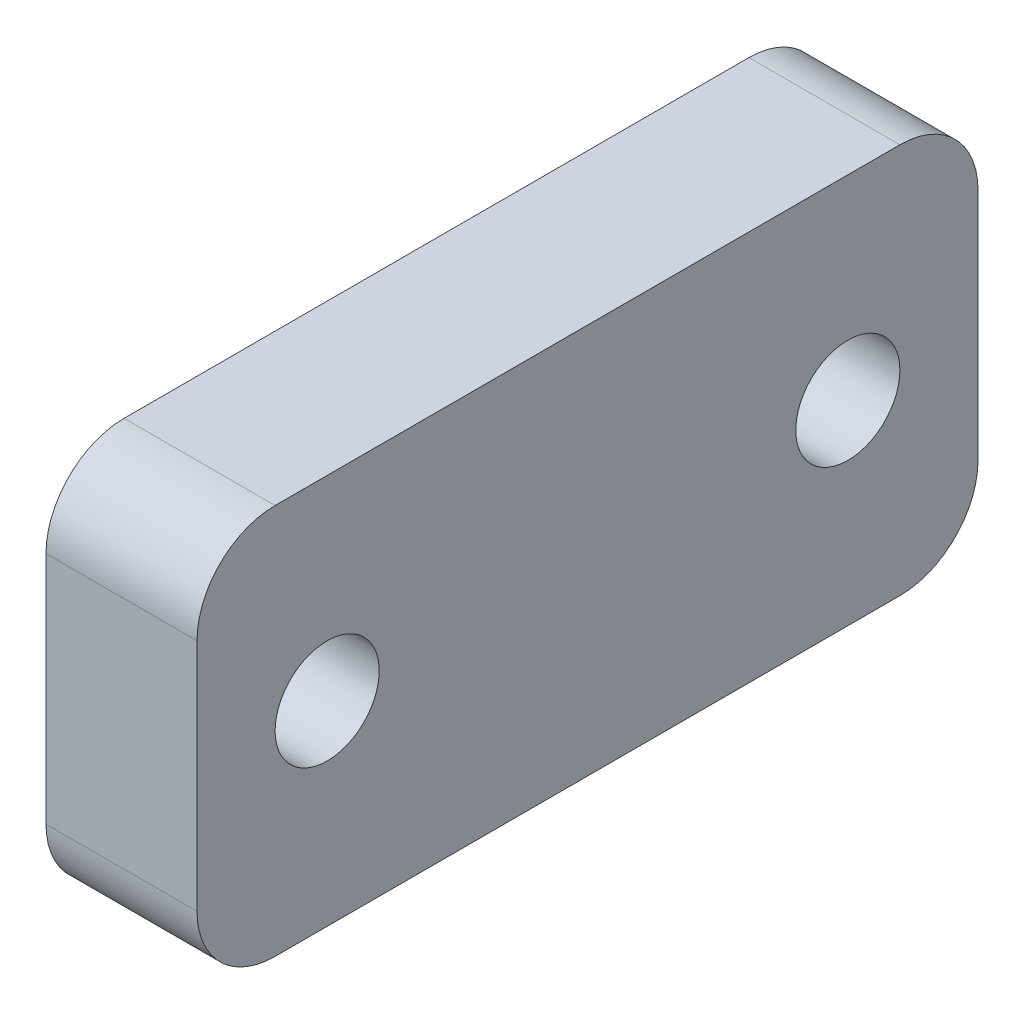
ISO-10303-21;
HEADER;
FILE_DESCRIPTION(('STEP AP214'),'2;1');
FILE_NAME('part.step','',(''),(''),'','','');
FILE_SCHEMA(('AUTOMOTIVE_DESIGN { 1 0 10303 214 1 1 1 1 }'));
ENDSEC;
DATA;
#1=APPLICATION_CONTEXT('core data for automotive mechanical design processes');
#2=APPLICATION_PROTOCOL_DEFINITION('international standard','automotive_design',2000,#1);
#3=PRODUCT_CONTEXT('',#1,'mechanical');
#4=PRODUCT('Part','Part','',(#3));
#5=PRODUCT_RELATED_PRODUCT_CATEGORY('part','',(#4));
#6=PRODUCT_DEFINITION_FORMATION('','',#4);
#7=PRODUCT_DEFINITION_CONTEXT('part definition',#1,'design');
#8=PRODUCT_DEFINITION('design','',#6,#7);
#9=PRODUCT_DEFINITION_SHAPE('','',#8);
#10=(LENGTH_UNIT() NAMED_UNIT(*) SI_UNIT(.MILLI.,.METRE.));
#11=(NAMED_UNIT(*) PLANE_ANGLE_UNIT() SI_UNIT($,.RADIAN.));
#12=(NAMED_UNIT(*) SI_UNIT($,.STERADIAN.) SOLID_ANGLE_UNIT());
#13=UNCERTAINTY_MEASURE_WITH_UNIT(LENGTH_MEASURE(1.E-05),#10,'distance_accuracy_value','');
#14=(GEOMETRIC_REPRESENTATION_CONTEXT(3) GLOBAL_UNCERTAINTY_ASSIGNED_CONTEXT((#13)) GLOBAL_UNIT_ASSIGNED_CONTEXT((#10,
#11,#12)) REPRESENTATION_CONTEXT('',''));
#15=CARTESIAN_POINT('',(0.,0.,0.));
#16=DIRECTION('',(0.,0.,1.));
#17=DIRECTION('',(1.,0.,0.));
#18=AXIS2_PLACEMENT_3D('',#15,#16,#17);
#19=CARTESIAN_POINT('',(5.8,0.,0.));
#20=DIRECTION('',(-1.,0.,0.));
#21=DIRECTION('',(0.,0.,1.));
#22=AXIS2_PLACEMENT_3D('',#19,#20,#21);
#23=PLANE('',#22);
#24=DIRECTION('',(0.,-1.,0.));
#25=VECTOR('',#24,1.);
#26=CARTESIAN_POINT('',(5.8,-7.5,15.));
#27=LINE('',#26,#25);
#28=CARTESIAN_POINT('',(5.8,4.5,15.));
#29=VERTEX_POINT('',#28);
#30=CARTESIAN_POINT('',(5.8,-4.5,15.));
#31=VERTEX_POINT('',#30);
#32=EDGE_CURVE('E173',#29,#31,#27,.T.);
#33=ORIENTED_EDGE('',*,*,#32,.T.);
#34=CARTESIAN_POINT('',(5.8,-4.5,12.));
#35=DIRECTION('',(-1.,0.,0.));
#36=DIRECTION('',(0.,0.,1.));
#37=AXIS2_PLACEMENT_3D('',#34,#35,#36);
#38=CIRCLE('',#37,3.);
#39=CARTESIAN_POINT('',(5.8,-7.5,12.));
#40=VERTEX_POINT('',#39);
#41=EDGE_CURVE('E150',#31,#40,#38,.F.);
#42=ORIENTED_EDGE('',*,*,#41,.T.);
#43=DIRECTION('',(0.,0.,-1.));
#44=VECTOR('',#43,1.);
#45=CARTESIAN_POINT('',(5.8,-7.5,15.));
#46=LINE('',#45,#44);
#47=CARTESIAN_POINT('',(5.8,-7.5,-12.));
#48=VERTEX_POINT('',#47);
#49=EDGE_CURVE('E121',#40,#48,#46,.T.);
#50=ORIENTED_EDGE('',*,*,#49,.T.);
#51=CARTESIAN_POINT('',(5.8,-4.5,-12.));
#52=DIRECTION('',(-1.,0.,0.));
#53=DIRECTION('',(0.,0.,1.));
#54=AXIS2_PLACEMENT_3D('',#51,#52,#53);
#55=CIRCLE('',#54,3.);
#56=CARTESIAN_POINT('',(5.8,-4.5,-15.));
#57=VERTEX_POINT('',#56);
#58=EDGE_CURVE('E148',#48,#57,#55,.F.);
#59=ORIENTED_EDGE('',*,*,#58,.T.);
#60=DIRECTION('',(0.,1.,0.));
#61=VECTOR('',#60,1.);
#62=CARTESIAN_POINT('',(5.8,-7.5,-15.));
#63=LINE('',#62,#61);
#64=CARTESIAN_POINT('',(5.8,4.5,-15.));
#65=VERTEX_POINT('',#64);
#66=EDGE_CURVE('E128',#57,#65,#63,.T.);
#67=ORIENTED_EDGE('',*,*,#66,.T.);
#68=CARTESIAN_POINT('',(5.8,4.5,-12.));
#69=DIRECTION('',(-1.,0.,0.));
#70=DIRECTION('',(0.,0.,1.));
#71=AXIS2_PLACEMENT_3D('',#68,#69,#70);
#72=CIRCLE('',#71,3.);
#73=CARTESIAN_POINT('',(5.8,7.5,-12.));
#74=VERTEX_POINT('',#73);
#75=EDGE_CURVE('E56',#65,#74,#72,.F.);
#76=ORIENTED_EDGE('',*,*,#75,.T.);
#77=DIRECTION('',(0.,0.,1.));
#78=VECTOR('',#77,1.);
#79=CARTESIAN_POINT('',(5.8,7.5,15.));
#80=LINE('',#79,#78);
#81=CARTESIAN_POINT('',(5.8,7.5,12.));
#82=VERTEX_POINT('',#81);
#83=EDGE_CURVE('E131',#74,#82,#80,.T.);
#84=ORIENTED_EDGE('',*,*,#83,.T.);
#85=CARTESIAN_POINT('',(5.8,4.5,12.));
#86=DIRECTION('',(-1.,0.,0.));
#87=DIRECTION('',(0.,0.,1.));
#88=AXIS2_PLACEMENT_3D('',#85,#86,#87);
#89=CIRCLE('',#88,3.);
#90=EDGE_CURVE('E145',#82,#29,#89,.F.);
#91=ORIENTED_EDGE('',*,*,#90,.T.);
#92=EDGE_LOOP('',(#33,#42,#50,#59,#67,#76,#84,#91));
#93=FACE_BOUND('',#92,.T.);
#94=CARTESIAN_POINT('',(5.8,0.,-10.));
#95=DIRECTION('',(1.,0.,0.));
#96=DIRECTION('',(0.,0.,-1.));
#97=AXIS2_PLACEMENT_3D('',#94,#95,#96);
#98=CIRCLE('',#97,2.);
#99=CARTESIAN_POINT('',(5.8,0.,-12.));
#100=VERTEX_POINT('',#99);
#101=EDGE_CURVE('E166',#100,#100,#98,.T.);
#102=ORIENTED_EDGE('',*,*,#101,.F.);
#103=EDGE_LOOP('',(#102));
#104=FACE_BOUND('',#103,.T.);
#105=CARTESIAN_POINT('',(5.8,0.,10.));
#106=DIRECTION('',(1.,0.,0.));
#107=DIRECTION('',(0.,0.,1.));
#108=AXIS2_PLACEMENT_3D('',#105,#106,#107);
#109=CIRCLE('',#108,2.);
#110=CARTESIAN_POINT('',(5.8,0.,12.));
#111=VERTEX_POINT('',#110);
#112=EDGE_CURVE('E178',#111,#111,#109,.T.);
#113=ORIENTED_EDGE('',*,*,#112,.F.);
#114=EDGE_LOOP('',(#113));
#115=FACE_BOUND('',#114,.T.);
#116=ADVANCED_FACE('F35',(#93,#104,#115),#23,.F.);
#117=CARTESIAN_POINT('',(0.,0.,0.));
#118=DIRECTION('',(-1.,0.,0.));
#119=DIRECTION('',(0.,0.,1.));
#120=AXIS2_PLACEMENT_3D('',#117,#118,#119);
#121=PLANE('',#120);
#122=CARTESIAN_POINT('',(0.,0.,-10.));
#123=DIRECTION('',(1.,0.,0.));
#124=DIRECTION('',(0.,0.,-1.));
#125=AXIS2_PLACEMENT_3D('',#122,#123,#124);
#126=CIRCLE('',#125,2.);
#127=CARTESIAN_POINT('',(0.,0.,-12.));
#128=VERTEX_POINT('',#127);
#129=EDGE_CURVE('E169',#128,#128,#126,.T.);
#130=ORIENTED_EDGE('',*,*,#129,.T.);
#131=EDGE_LOOP('',(#130));
#132=FACE_BOUND('',#131,.T.);
#133=DIRECTION('',(0.,0.,-1.));
#134=VECTOR('',#133,1.);
#135=CARTESIAN_POINT('',(0.,-7.5,15.));
#136=LINE('',#135,#134);
#137=CARTESIAN_POINT('',(0.,-7.5,12.));
#138=VERTEX_POINT('',#137);
#139=CARTESIAN_POINT('',(0.,-7.5,-12.));
#140=VERTEX_POINT('',#139);
#141=EDGE_CURVE('E118',#138,#140,#136,.T.);
#142=ORIENTED_EDGE('',*,*,#141,.F.);
#143=CARTESIAN_POINT('',(0.,-4.5,12.));
#144=DIRECTION('',(-1.,0.,0.));
#145=DIRECTION('',(0.,0.,1.));
#146=AXIS2_PLACEMENT_3D('',#143,#144,#145);
#147=CIRCLE('',#146,3.);
#148=CARTESIAN_POINT('',(0.,-4.5,15.));
#149=VERTEX_POINT('',#148);
#150=EDGE_CURVE('E101',#138,#149,#147,.T.);
#151=ORIENTED_EDGE('',*,*,#150,.T.);
#152=DIRECTION('',(0.,-1.,0.));
#153=VECTOR('',#152,1.);
#154=CARTESIAN_POINT('',(0.,-7.5,15.));
#155=LINE('',#154,#153);
#156=CARTESIAN_POINT('',(0.,4.5,15.));
#157=VERTEX_POINT('',#156);
#158=EDGE_CURVE('E129',#157,#149,#155,.T.);
#159=ORIENTED_EDGE('',*,*,#158,.F.);
#160=CARTESIAN_POINT('',(0.,4.5,12.));
#161=DIRECTION('',(-1.,0.,0.));
#162=DIRECTION('',(0.,0.,1.));
#163=AXIS2_PLACEMENT_3D('',#160,#161,#162);
#164=CIRCLE('',#163,3.);
#165=CARTESIAN_POINT('',(0.,7.5,12.));
#166=VERTEX_POINT('',#165);
#167=EDGE_CURVE('E122',#157,#166,#164,.T.);
#168=ORIENTED_EDGE('',*,*,#167,.T.);
#169=DIRECTION('',(0.,0.,1.));
#170=VECTOR('',#169,1.);
#171=CARTESIAN_POINT('',(0.,7.5,15.));
#172=LINE('',#171,#170);
#173=CARTESIAN_POINT('',(0.,7.5,-12.));
#174=VERTEX_POINT('',#173);
#175=EDGE_CURVE('E133',#174,#166,#172,.T.);
#176=ORIENTED_EDGE('',*,*,#175,.F.);
#177=CARTESIAN_POINT('',(0.,4.5,-12.));
#178=DIRECTION('',(-1.,0.,0.));
#179=DIRECTION('',(0.,0.,1.));
#180=AXIS2_PLACEMENT_3D('',#177,#178,#179);
#181=CIRCLE('',#180,3.);
#182=CARTESIAN_POINT('',(0.,4.5,-15.));
#183=VERTEX_POINT('',#182);
#184=EDGE_CURVE('E139',#174,#183,#181,.T.);
#185=ORIENTED_EDGE('',*,*,#184,.T.);
#186=DIRECTION('',(0.,1.,0.));
#187=VECTOR('',#186,1.);
#188=CARTESIAN_POINT('',(0.,-7.5,-15.));
#189=LINE('',#188,#187);
#190=CARTESIAN_POINT('',(0.,-4.5,-15.));
#191=VERTEX_POINT('',#190);
#192=EDGE_CURVE('E161',#191,#183,#189,.T.);
#193=ORIENTED_EDGE('',*,*,#192,.F.);
#194=CARTESIAN_POINT('',(0.,-4.5,-12.));
#195=DIRECTION('',(-1.,0.,0.));
#196=DIRECTION('',(0.,0.,1.));
#197=AXIS2_PLACEMENT_3D('',#194,#195,#196);
#198=CIRCLE('',#197,3.);
#199=EDGE_CURVE('E112',#191,#140,#198,.T.);
#200=ORIENTED_EDGE('',*,*,#199,.T.);
#201=EDGE_LOOP('',(#142,#151,#159,#168,#176,#185,#193,#200));
#202=FACE_BOUND('',#201,.T.);
#203=CARTESIAN_POINT('',(0.,0.,10.));
#204=DIRECTION('',(1.,0.,0.));
#205=DIRECTION('',(0.,0.,1.));
#206=AXIS2_PLACEMENT_3D('',#203,#204,#205);
#207=CIRCLE('',#206,2.);
#208=CARTESIAN_POINT('',(0.,0.,12.));
#209=VERTEX_POINT('',#208);
#210=EDGE_CURVE('E180',#209,#209,#207,.T.);
#211=ORIENTED_EDGE('',*,*,#210,.T.);
#212=EDGE_LOOP('',(#211));
#213=FACE_BOUND('',#212,.T.);
#214=ADVANCED_FACE('F125',(#132,#202,#213),#121,.T.);
#215=CARTESIAN_POINT('',(5.8,-7.5,-15.));
#216=DIRECTION('',(0.,0.,1.));
#217=DIRECTION('',(1.,0.,0.));
#218=AXIS2_PLACEMENT_3D('',#215,#216,#217);
#219=PLANE('',#218);
#220=ORIENTED_EDGE('',*,*,#66,.F.);
#221=DIRECTION('',(-1.,0.,0.));
#222=VECTOR('',#221,1.);
#223=CARTESIAN_POINT('',(5.8,-4.5,-15.));
#224=LINE('',#223,#222);
#225=EDGE_CURVE('E154',#57,#191,#224,.T.);
#226=ORIENTED_EDGE('',*,*,#225,.T.);
#227=ORIENTED_EDGE('',*,*,#192,.T.);
#228=DIRECTION('',(-1.,0.,0.));
#229=VECTOR('',#228,1.);
#230=CARTESIAN_POINT('',(5.8,4.5,-15.));
#231=LINE('',#230,#229);
#232=EDGE_CURVE('E152',#183,#65,#231,.F.);
#233=ORIENTED_EDGE('',*,*,#232,.T.);
#234=EDGE_LOOP('',(#220,#226,#227,#233));
#235=FACE_BOUND('',#234,.T.);
#236=ADVANCED_FACE('F160',(#235),#219,.F.);
#237=CARTESIAN_POINT('',(5.8,7.5,15.));
#238=DIRECTION('',(0.,-1.,0.));
#239=DIRECTION('',(0.,0.,-1.));
#240=AXIS2_PLACEMENT_3D('',#237,#238,#239);
#241=PLANE('',#240);
#242=ORIENTED_EDGE('',*,*,#83,.F.);
#243=DIRECTION('',(-1.,0.,0.));
#244=VECTOR('',#243,1.);
#245=CARTESIAN_POINT('',(5.8,7.5,-12.));
#246=LINE('',#245,#244);
#247=EDGE_CURVE('E11',#74,#174,#246,.T.);
#248=ORIENTED_EDGE('',*,*,#247,.T.);
#249=ORIENTED_EDGE('',*,*,#175,.T.);
#250=DIRECTION('',(-1.,0.,0.));
#251=VECTOR('',#250,1.);
#252=CARTESIAN_POINT('',(5.8,7.5,12.));
#253=LINE('',#252,#251);
#254=EDGE_CURVE('E43',#166,#82,#253,.F.);
#255=ORIENTED_EDGE('',*,*,#254,.T.);
#256=EDGE_LOOP('',(#242,#248,#249,#255));
#257=FACE_BOUND('',#256,.T.);
#258=ADVANCED_FACE('F206',(#257),#241,.F.);
#259=CARTESIAN_POINT('',(5.8,-7.5,15.));
#260=DIRECTION('',(0.,0.,-1.));
#261=DIRECTION('',(-1.,0.,0.));
#262=AXIS2_PLACEMENT_3D('',#259,#260,#261);
#263=PLANE('',#262);
#264=ORIENTED_EDGE('',*,*,#158,.T.);
#265=DIRECTION('',(-1.,0.,0.));
#266=VECTOR('',#265,1.);
#267=CARTESIAN_POINT('',(5.8,-4.5,15.));
#268=LINE('',#267,#266);
#269=EDGE_CURVE('E106',#149,#31,#268,.F.);
#270=ORIENTED_EDGE('',*,*,#269,.T.);
#271=ORIENTED_EDGE('',*,*,#32,.F.);
#272=DIRECTION('',(-1.,0.,0.));
#273=VECTOR('',#272,1.);
#274=CARTESIAN_POINT('',(5.8,4.5,15.));
#275=LINE('',#274,#273);
#276=EDGE_CURVE('E111',#29,#157,#275,.T.);
#277=ORIENTED_EDGE('',*,*,#276,.T.);
#278=EDGE_LOOP('',(#264,#270,#271,#277));
#279=FACE_BOUND('',#278,.T.);
#280=ADVANCED_FACE('F203',(#279),#263,.F.);
#281=CARTESIAN_POINT('',(5.8,-7.5,15.));
#282=DIRECTION('',(0.,1.,0.));
#283=DIRECTION('',(0.,0.,1.));
#284=AXIS2_PLACEMENT_3D('',#281,#282,#283);
#285=PLANE('',#284);
#286=ORIENTED_EDGE('',*,*,#49,.F.);
#287=DIRECTION('',(-1.,0.,0.));
#288=VECTOR('',#287,1.);
#289=CARTESIAN_POINT('',(5.8,-7.5,12.));
#290=LINE('',#289,#288);
#291=EDGE_CURVE('E105',#40,#138,#290,.T.);
#292=ORIENTED_EDGE('',*,*,#291,.T.);
#293=ORIENTED_EDGE('',*,*,#141,.T.);
#294=DIRECTION('',(-1.,0.,0.));
#295=VECTOR('',#294,1.);
#296=CARTESIAN_POINT('',(5.8,-7.5,-12.));
#297=LINE('',#296,#295);
#298=EDGE_CURVE('E123',#140,#48,#297,.F.);
#299=ORIENTED_EDGE('',*,*,#298,.T.);
#300=EDGE_LOOP('',(#286,#292,#293,#299));
#301=FACE_BOUND('',#300,.T.);
#302=ADVANCED_FACE('F117',(#301),#285,.F.);
#303=CARTESIAN_POINT('',(5.8,0.,-10.));
#304=DIRECTION('',(-1.,0.,0.));
#305=DIRECTION('',(0.,0.,1.));
#306=AXIS2_PLACEMENT_3D('',#303,#304,#305);
#307=CYLINDRICAL_SURFACE('',#306,2.);
#308=ORIENTED_EDGE('',*,*,#101,.T.);
#309=EDGE_LOOP('',(#308));
#310=FACE_BOUND('',#309,.T.);
#311=ORIENTED_EDGE('',*,*,#129,.F.);
#312=EDGE_LOOP('',(#311));
#313=FACE_BOUND('',#312,.T.);
#314=ADVANCED_FACE('F198',(#310,#313),#307,.F.);
#315=CARTESIAN_POINT('',(5.8,0.,10.));
#316=DIRECTION('',(-1.,0.,0.));
#317=DIRECTION('',(0.,0.,1.));
#318=AXIS2_PLACEMENT_3D('',#315,#316,#317);
#319=CYLINDRICAL_SURFACE('',#318,2.);
#320=ORIENTED_EDGE('',*,*,#112,.T.);
#321=EDGE_LOOP('',(#320));
#322=FACE_BOUND('',#321,.T.);
#323=ORIENTED_EDGE('',*,*,#210,.F.);
#324=EDGE_LOOP('',(#323));
#325=FACE_BOUND('',#324,.T.);
#326=ADVANCED_FACE('F186',(#322,#325),#319,.F.);
#327=CARTESIAN_POINT('',(5.8,-4.5,12.));
#328=DIRECTION('',(-1.,0.,0.));
#329=DIRECTION('',(0.,0.,1.));
#330=AXIS2_PLACEMENT_3D('',#327,#328,#329);
#331=CYLINDRICAL_SURFACE('',#330,3.);
#332=ORIENTED_EDGE('',*,*,#41,.F.);
#333=ORIENTED_EDGE('',*,*,#269,.F.);
#334=ORIENTED_EDGE('',*,*,#150,.F.);
#335=ORIENTED_EDGE('',*,*,#291,.F.);
#336=EDGE_LOOP('',(#332,#333,#334,#335));
#337=FACE_BOUND('',#336,.T.);
#338=ADVANCED_FACE('F104',(#337),#331,.T.);
#339=CARTESIAN_POINT('',(5.8,-4.5,-12.));
#340=DIRECTION('',(-1.,0.,0.));
#341=DIRECTION('',(0.,0.,1.));
#342=AXIS2_PLACEMENT_3D('',#339,#340,#341);
#343=CYLINDRICAL_SURFACE('',#342,3.);
#344=ORIENTED_EDGE('',*,*,#58,.F.);
#345=ORIENTED_EDGE('',*,*,#298,.F.);
#346=ORIENTED_EDGE('',*,*,#199,.F.);
#347=ORIENTED_EDGE('',*,*,#225,.F.);
#348=EDGE_LOOP('',(#344,#345,#346,#347));
#349=FACE_BOUND('',#348,.T.);
#350=ADVANCED_FACE('F214',(#349),#343,.T.);
#351=CARTESIAN_POINT('',(5.8,4.5,-12.));
#352=DIRECTION('',(-1.,0.,0.));
#353=DIRECTION('',(0.,0.,1.));
#354=AXIS2_PLACEMENT_3D('',#351,#352,#353);
#355=CYLINDRICAL_SURFACE('',#354,3.);
#356=ORIENTED_EDGE('',*,*,#75,.F.);
#357=ORIENTED_EDGE('',*,*,#232,.F.);
#358=ORIENTED_EDGE('',*,*,#184,.F.);
#359=ORIENTED_EDGE('',*,*,#247,.F.);
#360=EDGE_LOOP('',(#356,#357,#358,#359));
#361=FACE_BOUND('',#360,.T.);
#362=ADVANCED_FACE('F216',(#361),#355,.T.);
#363=CARTESIAN_POINT('',(5.8,4.5,12.));
#364=DIRECTION('',(-1.,0.,0.));
#365=DIRECTION('',(0.,0.,1.));
#366=AXIS2_PLACEMENT_3D('',#363,#364,#365);
#367=CYLINDRICAL_SURFACE('',#366,3.);
#368=ORIENTED_EDGE('',*,*,#90,.F.);
#369=ORIENTED_EDGE('',*,*,#254,.F.);
#370=ORIENTED_EDGE('',*,*,#167,.F.);
#371=ORIENTED_EDGE('',*,*,#276,.F.);
#372=EDGE_LOOP('',(#368,#369,#370,#371));
#373=FACE_BOUND('',#372,.T.);
#374=ADVANCED_FACE('F37',(#373),#367,.T.);
#375=CLOSED_SHELL('',(#116,#214,#236,#258,#280,#302,#314,#326,#338,#350,#362,#374));
#376=MANIFOLD_SOLID_BREP('B2',#375);
#377=ADVANCED_BREP_SHAPE_REPRESENTATION('',(#18,#376),#14);
#378=SHAPE_DEFINITION_REPRESENTATION(#9,#377);
ENDSEC;
END-ISO-10303-21;
